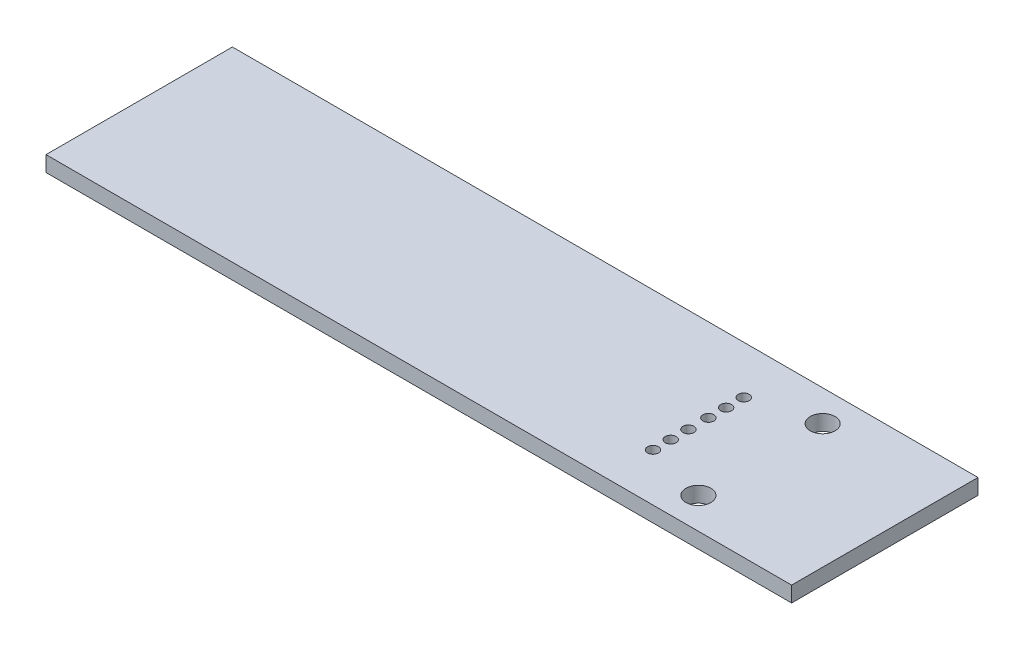
ISO-10303-21;
HEADER;
FILE_DESCRIPTION(('STEP AP214'),'2;1');
FILE_NAME('part.step','',(''),(''),'','','');
FILE_SCHEMA(('AUTOMOTIVE_DESIGN { 1 0 10303 214 1 1 1 1 }'));
ENDSEC;
DATA;
#1=APPLICATION_CONTEXT('core data for automotive mechanical design processes');
#2=APPLICATION_PROTOCOL_DEFINITION('international standard','automotive_design',2000,#1);
#3=PRODUCT_CONTEXT('',#1,'mechanical');
#4=PRODUCT('Part','Part','',(#3));
#5=PRODUCT_RELATED_PRODUCT_CATEGORY('part','',(#4));
#6=PRODUCT_DEFINITION_FORMATION('','',#4);
#7=PRODUCT_DEFINITION_CONTEXT('part definition',#1,'design');
#8=PRODUCT_DEFINITION('design','',#6,#7);
#9=PRODUCT_DEFINITION_SHAPE('','',#8);
#10=(LENGTH_UNIT() NAMED_UNIT(*) SI_UNIT(.MILLI.,.METRE.));
#11=(NAMED_UNIT(*) PLANE_ANGLE_UNIT() SI_UNIT($,.RADIAN.));
#12=(NAMED_UNIT(*) SI_UNIT($,.STERADIAN.) SOLID_ANGLE_UNIT());
#13=UNCERTAINTY_MEASURE_WITH_UNIT(LENGTH_MEASURE(1.E-05),#10,'distance_accuracy_value','');
#14=(GEOMETRIC_REPRESENTATION_CONTEXT(3) GLOBAL_UNCERTAINTY_ASSIGNED_CONTEXT((#13)) GLOBAL_UNIT_ASSIGNED_CONTEXT((#10,
#11,#12)) REPRESENTATION_CONTEXT('',''));
#15=CARTESIAN_POINT('',(0.,0.,0.));
#16=DIRECTION('',(0.,0.,1.));
#17=DIRECTION('',(1.,0.,0.));
#18=AXIS2_PLACEMENT_3D('',#15,#16,#17);
#19=CARTESIAN_POINT('',(0.,1.5875,0.));
#20=DIRECTION('',(0.,1.,0.));
#21=DIRECTION('',(0.,0.,1.));
#22=AXIS2_PLACEMENT_3D('',#19,#20,#21);
#23=PLANE('',#22);
#24=CARTESIAN_POINT('',(19.05,1.5875,-2.82923288451083));
#25=DIRECTION('',(0.,1.,0.));
#26=DIRECTION('',(0.,0.,1.));
#27=AXIS2_PLACEMENT_3D('',#24,#25,#26);
#28=CIRCLE('',#27,0.558095422726709);
#29=CARTESIAN_POINT('',(19.05,1.5875,-2.27113746178412));
#30=VERTEX_POINT('',#29);
#31=EDGE_CURVE('E147',#30,#30,#28,.T.);
#32=ORIENTED_EDGE('',*,*,#31,.F.);
#33=EDGE_LOOP('',(#32));
#34=FACE_BOUND('',#33,.T.);
#35=CARTESIAN_POINT('',(19.05,1.5875,1.021597478357));
#36=DIRECTION('',(0.,1.,0.));
#37=DIRECTION('',(0.,0.,1.));
#38=AXIS2_PLACEMENT_3D('',#35,#36,#37);
#39=CIRCLE('',#38,0.558095422726705);
#40=CARTESIAN_POINT('',(19.05,1.5875,1.5796929010837));
#41=VERTEX_POINT('',#40);
#42=EDGE_CURVE('E135',#41,#41,#39,.T.);
#43=ORIENTED_EDGE('',*,*,#42,.F.);
#44=EDGE_LOOP('',(#43));
#45=FACE_BOUND('',#44,.T.);
#46=CARTESIAN_POINT('',(19.05,1.5875,4.63686829066466));
#47=DIRECTION('',(0.,1.,0.));
#48=DIRECTION('',(0.,0.,1.));
#49=AXIS2_PLACEMENT_3D('',#46,#47,#48);
#50=CIRCLE('',#49,0.558095422726705);
#51=CARTESIAN_POINT('',(19.05,1.5875,5.19496371339137));
#52=VERTEX_POINT('',#51);
#53=EDGE_CURVE('E123',#52,#52,#50,.T.);
#54=ORIENTED_EDGE('',*,*,#53,.F.);
#55=EDGE_LOOP('',(#54));
#56=FACE_BOUND('',#55,.T.);
#57=CARTESIAN_POINT('',(25.4,1.5875,-6.35));
#58=DIRECTION('',(0.,1.,0.));
#59=DIRECTION('',(0.,0.,1.));
#60=AXIS2_PLACEMENT_3D('',#57,#58,#59);
#61=CIRCLE('',#60,1.27);
#62=CARTESIAN_POINT('',(25.4,1.5875,-5.08));
#63=VERTEX_POINT('',#62);
#64=EDGE_CURVE('E102',#63,#63,#61,.T.);
#65=ORIENTED_EDGE('',*,*,#64,.F.);
#66=EDGE_LOOP('',(#65));
#67=FACE_BOUND('',#66,.T.);
#68=DIRECTION('',(0.,0.,1.));
#69=VECTOR('',#68,1.);
#70=CARTESIAN_POINT('',(-38.1,1.5875,-9.525));
#71=LINE('',#70,#69);
#72=CARTESIAN_POINT('',(-38.1,1.5875,-9.525));
#73=VERTEX_POINT('',#72);
#74=CARTESIAN_POINT('',(-38.1,1.5875,9.525));
#75=VERTEX_POINT('',#74);
#76=EDGE_CURVE('E87',#73,#75,#71,.T.);
#77=ORIENTED_EDGE('',*,*,#76,.T.);
#78=DIRECTION('',(1.,0.,0.));
#79=VECTOR('',#78,1.);
#80=CARTESIAN_POINT('',(-38.1,1.5875,9.525));
#81=LINE('',#80,#79);
#82=CARTESIAN_POINT('',(38.1,1.5875,9.525));
#83=VERTEX_POINT('',#82);
#84=EDGE_CURVE('E82',#75,#83,#81,.T.);
#85=ORIENTED_EDGE('',*,*,#84,.T.);
#86=DIRECTION('',(0.,0.,-1.));
#87=VECTOR('',#86,1.);
#88=CARTESIAN_POINT('',(38.1,1.5875,-9.525));
#89=LINE('',#88,#87);
#90=CARTESIAN_POINT('',(38.1,1.5875,-9.525));
#91=VERTEX_POINT('',#90);
#92=EDGE_CURVE('E85',#83,#91,#89,.T.);
#93=ORIENTED_EDGE('',*,*,#92,.T.);
#94=DIRECTION('',(-1.,0.,0.));
#95=VECTOR('',#94,1.);
#96=CARTESIAN_POINT('',(-38.1,1.5875,-9.525));
#97=LINE('',#96,#95);
#98=EDGE_CURVE('E52',#91,#73,#97,.T.);
#99=ORIENTED_EDGE('',*,*,#98,.T.);
#100=EDGE_LOOP('',(#77,#85,#93,#99));
#101=FACE_BOUND('',#100,.T.);
#102=CARTESIAN_POINT('',(25.4,1.5875,6.35));
#103=DIRECTION('',(0.,1.,0.));
#104=DIRECTION('',(0.,0.,1.));
#105=AXIS2_PLACEMENT_3D('',#102,#103,#104);
#106=CIRCLE('',#105,1.27);
#107=CARTESIAN_POINT('',(25.4,1.5875,7.62));
#108=VERTEX_POINT('',#107);
#109=EDGE_CURVE('E117',#108,#108,#106,.T.);
#110=ORIENTED_EDGE('',*,*,#109,.F.);
#111=EDGE_LOOP('',(#110));
#112=FACE_BOUND('',#111,.T.);
#113=CARTESIAN_POINT('',(19.05,1.5875,2.82923288451083));
#114=DIRECTION('',(0.,1.,0.));
#115=DIRECTION('',(0.,0.,1.));
#116=AXIS2_PLACEMENT_3D('',#113,#114,#115);
#117=CIRCLE('',#116,0.558095422726705);
#118=CARTESIAN_POINT('',(19.05,1.5875,3.38732830723753));
#119=VERTEX_POINT('',#118);
#120=EDGE_CURVE('E129',#119,#119,#117,.T.);
#121=ORIENTED_EDGE('',*,*,#120,.F.);
#122=EDGE_LOOP('',(#121));
#123=FACE_BOUND('',#122,.T.);
#124=CARTESIAN_POINT('',(19.05,1.5875,-4.63686829066466));
#125=DIRECTION('',(0.,1.,0.));
#126=DIRECTION('',(0.,0.,1.));
#127=AXIS2_PLACEMENT_3D('',#124,#125,#126);
#128=CIRCLE('',#127,0.558095422726709);
#129=CARTESIAN_POINT('',(19.05,1.5875,-4.07877286793795));
#130=VERTEX_POINT('',#129);
#131=EDGE_CURVE('E141',#130,#130,#128,.T.);
#132=ORIENTED_EDGE('',*,*,#131,.F.);
#133=EDGE_LOOP('',(#132));
#134=FACE_BOUND('',#133,.T.);
#135=CARTESIAN_POINT('',(19.05,1.5875,-1.021597478357));
#136=DIRECTION('',(0.,1.,0.));
#137=DIRECTION('',(0.,0.,1.));
#138=AXIS2_PLACEMENT_3D('',#135,#136,#137);
#139=CIRCLE('',#138,0.558095422726709);
#140=CARTESIAN_POINT('',(19.05,1.5875,-0.46350205563029));
#141=VERTEX_POINT('',#140);
#142=EDGE_CURVE('E153',#141,#141,#139,.T.);
#143=ORIENTED_EDGE('',*,*,#142,.F.);
#144=EDGE_LOOP('',(#143));
#145=FACE_BOUND('',#144,.T.);
#146=ADVANCED_FACE('F35',(#34,#45,#56,#67,#101,#112,#123,#134,#145),#23,.T.);
#147=CARTESIAN_POINT('',(0.,0.,0.));
#148=DIRECTION('',(0.,1.,0.));
#149=DIRECTION('',(0.,0.,1.));
#150=AXIS2_PLACEMENT_3D('',#147,#148,#149);
#151=PLANE('',#150);
#152=DIRECTION('',(0.,0.,1.));
#153=VECTOR('',#152,1.);
#154=CARTESIAN_POINT('',(-38.1,0.,-9.525));
#155=LINE('',#154,#153);
#156=CARTESIAN_POINT('',(-38.1,0.,-9.525));
#157=VERTEX_POINT('',#156);
#158=CARTESIAN_POINT('',(-38.1,0.,9.525));
#159=VERTEX_POINT('',#158);
#160=EDGE_CURVE('E99',#157,#159,#155,.T.);
#161=ORIENTED_EDGE('',*,*,#160,.F.);
#162=DIRECTION('',(-1.,0.,0.));
#163=VECTOR('',#162,1.);
#164=CARTESIAN_POINT('',(-38.1,0.,-9.525));
#165=LINE('',#164,#163);
#166=CARTESIAN_POINT('',(38.1,0.,-9.525));
#167=VERTEX_POINT('',#166);
#168=EDGE_CURVE('E75',#167,#157,#165,.T.);
#169=ORIENTED_EDGE('',*,*,#168,.F.);
#170=DIRECTION('',(0.,0.,-1.));
#171=VECTOR('',#170,1.);
#172=CARTESIAN_POINT('',(38.1,0.,-9.525));
#173=LINE('',#172,#171);
#174=CARTESIAN_POINT('',(38.1,0.,9.525));
#175=VERTEX_POINT('',#174);
#176=EDGE_CURVE('E69',#175,#167,#173,.T.);
#177=ORIENTED_EDGE('',*,*,#176,.F.);
#178=DIRECTION('',(1.,0.,0.));
#179=VECTOR('',#178,1.);
#180=CARTESIAN_POINT('',(-38.1,0.,9.525));
#181=LINE('',#180,#179);
#182=EDGE_CURVE('E91',#159,#175,#181,.T.);
#183=ORIENTED_EDGE('',*,*,#182,.F.);
#184=EDGE_LOOP('',(#161,#169,#177,#183));
#185=FACE_BOUND('',#184,.T.);
#186=CARTESIAN_POINT('',(25.4,0.,-6.35));
#187=DIRECTION('',(0.,1.,0.));
#188=DIRECTION('',(0.,0.,1.));
#189=AXIS2_PLACEMENT_3D('',#186,#187,#188);
#190=CIRCLE('',#189,1.27);
#191=CARTESIAN_POINT('',(25.4,0.,-5.08));
#192=VERTEX_POINT('',#191);
#193=EDGE_CURVE('E114',#192,#192,#190,.T.);
#194=ORIENTED_EDGE('',*,*,#193,.T.);
#195=EDGE_LOOP('',(#194));
#196=FACE_BOUND('',#195,.T.);
#197=CARTESIAN_POINT('',(25.4,0.,6.35));
#198=DIRECTION('',(0.,1.,0.));
#199=DIRECTION('',(0.,0.,1.));
#200=AXIS2_PLACEMENT_3D('',#197,#198,#199);
#201=CIRCLE('',#200,1.27);
#202=CARTESIAN_POINT('',(25.4,0.,7.62));
#203=VERTEX_POINT('',#202);
#204=EDGE_CURVE('E120',#203,#203,#201,.T.);
#205=ORIENTED_EDGE('',*,*,#204,.T.);
#206=EDGE_LOOP('',(#205));
#207=FACE_BOUND('',#206,.T.);
#208=CARTESIAN_POINT('',(19.05,0.,4.63686829066466));
#209=DIRECTION('',(0.,1.,0.));
#210=DIRECTION('',(0.,0.,1.));
#211=AXIS2_PLACEMENT_3D('',#208,#209,#210);
#212=CIRCLE('',#211,0.558095422726705);
#213=CARTESIAN_POINT('',(19.05,0.,5.19496371339137));
#214=VERTEX_POINT('',#213);
#215=EDGE_CURVE('E126',#214,#214,#212,.T.);
#216=ORIENTED_EDGE('',*,*,#215,.T.);
#217=EDGE_LOOP('',(#216));
#218=FACE_BOUND('',#217,.T.);
#219=CARTESIAN_POINT('',(19.05,0.,2.82923288451083));
#220=DIRECTION('',(0.,1.,0.));
#221=DIRECTION('',(0.,0.,1.));
#222=AXIS2_PLACEMENT_3D('',#219,#220,#221);
#223=CIRCLE('',#222,0.558095422726705);
#224=CARTESIAN_POINT('',(19.05,0.,3.38732830723753));
#225=VERTEX_POINT('',#224);
#226=EDGE_CURVE('E132',#225,#225,#223,.T.);
#227=ORIENTED_EDGE('',*,*,#226,.T.);
#228=EDGE_LOOP('',(#227));
#229=FACE_BOUND('',#228,.T.);
#230=CARTESIAN_POINT('',(19.05,0.,1.021597478357));
#231=DIRECTION('',(0.,1.,0.));
#232=DIRECTION('',(0.,0.,1.));
#233=AXIS2_PLACEMENT_3D('',#230,#231,#232);
#234=CIRCLE('',#233,0.558095422726705);
#235=CARTESIAN_POINT('',(19.05,0.,1.5796929010837));
#236=VERTEX_POINT('',#235);
#237=EDGE_CURVE('E138',#236,#236,#234,.T.);
#238=ORIENTED_EDGE('',*,*,#237,.T.);
#239=EDGE_LOOP('',(#238));
#240=FACE_BOUND('',#239,.T.);
#241=CARTESIAN_POINT('',(19.05,0.,-4.63686829066466));
#242=DIRECTION('',(0.,1.,0.));
#243=DIRECTION('',(0.,0.,1.));
#244=AXIS2_PLACEMENT_3D('',#241,#242,#243);
#245=CIRCLE('',#244,0.558095422726709);
#246=CARTESIAN_POINT('',(19.05,0.,-4.07877286793795));
#247=VERTEX_POINT('',#246);
#248=EDGE_CURVE('E144',#247,#247,#245,.T.);
#249=ORIENTED_EDGE('',*,*,#248,.T.);
#250=EDGE_LOOP('',(#249));
#251=FACE_BOUND('',#250,.T.);
#252=CARTESIAN_POINT('',(19.05,0.,-2.82923288451083));
#253=DIRECTION('',(0.,1.,0.));
#254=DIRECTION('',(0.,0.,1.));
#255=AXIS2_PLACEMENT_3D('',#252,#253,#254);
#256=CIRCLE('',#255,0.558095422726709);
#257=CARTESIAN_POINT('',(19.05,0.,-2.27113746178412));
#258=VERTEX_POINT('',#257);
#259=EDGE_CURVE('E150',#258,#258,#256,.T.);
#260=ORIENTED_EDGE('',*,*,#259,.T.);
#261=EDGE_LOOP('',(#260));
#262=FACE_BOUND('',#261,.T.);
#263=CARTESIAN_POINT('',(19.05,0.,-1.021597478357));
#264=DIRECTION('',(0.,1.,0.));
#265=DIRECTION('',(0.,0.,1.));
#266=AXIS2_PLACEMENT_3D('',#263,#264,#265);
#267=CIRCLE('',#266,0.558095422726709);
#268=CARTESIAN_POINT('',(19.05,0.,-0.46350205563029));
#269=VERTEX_POINT('',#268);
#270=EDGE_CURVE('E156',#269,#269,#267,.T.);
#271=ORIENTED_EDGE('',*,*,#270,.T.);
#272=EDGE_LOOP('',(#271));
#273=FACE_BOUND('',#272,.T.);
#274=ADVANCED_FACE('F110',(#185,#196,#207,#218,#229,#240,#251,#262,#273),#151,.F.);
#275=CARTESIAN_POINT('',(-38.1,1.5875,-9.525));
#276=DIRECTION('',(1.,0.,0.));
#277=DIRECTION('',(0.,0.,-1.));
#278=AXIS2_PLACEMENT_3D('',#275,#276,#277);
#279=PLANE('',#278);
#280=ORIENTED_EDGE('',*,*,#160,.T.);
#281=DIRECTION('',(0.,-1.,0.));
#282=VECTOR('',#281,1.);
#283=CARTESIAN_POINT('',(-38.1,1.5875,9.525));
#284=LINE('',#283,#282);
#285=EDGE_CURVE('E11',#75,#159,#284,.T.);
#286=ORIENTED_EDGE('',*,*,#285,.F.);
#287=ORIENTED_EDGE('',*,*,#76,.F.);
#288=DIRECTION('',(0.,-1.,0.));
#289=VECTOR('',#288,1.);
#290=CARTESIAN_POINT('',(-38.1,1.5875,-9.525));
#291=LINE('',#290,#289);
#292=EDGE_CURVE('E95',#73,#157,#291,.T.);
#293=ORIENTED_EDGE('',*,*,#292,.T.);
#294=EDGE_LOOP('',(#280,#286,#287,#293));
#295=FACE_BOUND('',#294,.T.);
#296=ADVANCED_FACE('F37',(#295),#279,.F.);
#297=CARTESIAN_POINT('',(-38.1,1.5875,9.525));
#298=DIRECTION('',(0.,0.,-1.));
#299=DIRECTION('',(-1.,0.,0.));
#300=AXIS2_PLACEMENT_3D('',#297,#298,#299);
#301=PLANE('',#300);
#302=ORIENTED_EDGE('',*,*,#182,.T.);
#303=DIRECTION('',(0.,-1.,0.));
#304=VECTOR('',#303,1.);
#305=CARTESIAN_POINT('',(38.1,1.5875,9.525));
#306=LINE('',#305,#304);
#307=EDGE_CURVE('E44',#83,#175,#306,.T.);
#308=ORIENTED_EDGE('',*,*,#307,.F.);
#309=ORIENTED_EDGE('',*,*,#84,.F.);
#310=ORIENTED_EDGE('',*,*,#285,.T.);
#311=EDGE_LOOP('',(#302,#308,#309,#310));
#312=FACE_BOUND('',#311,.T.);
#313=ADVANCED_FACE('F90',(#312),#301,.F.);
#314=CARTESIAN_POINT('',(38.1,1.5875,-9.525));
#315=DIRECTION('',(-1.,0.,0.));
#316=DIRECTION('',(0.,0.,1.));
#317=AXIS2_PLACEMENT_3D('',#314,#315,#316);
#318=PLANE('',#317);
#319=ORIENTED_EDGE('',*,*,#176,.T.);
#320=DIRECTION('',(0.,-1.,0.));
#321=VECTOR('',#320,1.);
#322=CARTESIAN_POINT('',(38.1,1.5875,-9.525));
#323=LINE('',#322,#321);
#324=EDGE_CURVE('E92',#91,#167,#323,.T.);
#325=ORIENTED_EDGE('',*,*,#324,.F.);
#326=ORIENTED_EDGE('',*,*,#92,.F.);
#327=ORIENTED_EDGE('',*,*,#307,.T.);
#328=EDGE_LOOP('',(#319,#325,#326,#327));
#329=FACE_BOUND('',#328,.T.);
#330=ADVANCED_FACE('F93',(#329),#318,.F.);
#331=CARTESIAN_POINT('',(-38.1,1.5875,-9.525));
#332=DIRECTION('',(0.,0.,1.));
#333=DIRECTION('',(1.,0.,0.));
#334=AXIS2_PLACEMENT_3D('',#331,#332,#333);
#335=PLANE('',#334);
#336=ORIENTED_EDGE('',*,*,#168,.T.);
#337=ORIENTED_EDGE('',*,*,#292,.F.);
#338=ORIENTED_EDGE('',*,*,#98,.F.);
#339=ORIENTED_EDGE('',*,*,#324,.T.);
#340=EDGE_LOOP('',(#336,#337,#338,#339));
#341=FACE_BOUND('',#340,.T.);
#342=ADVANCED_FACE('F107',(#341),#335,.F.);
#343=CARTESIAN_POINT('',(25.4,1.5875,-6.35));
#344=DIRECTION('',(0.,-1.,0.));
#345=DIRECTION('',(0.,0.,-1.));
#346=AXIS2_PLACEMENT_3D('',#343,#344,#345);
#347=CYLINDRICAL_SURFACE('',#346,1.27);
#348=ORIENTED_EDGE('',*,*,#64,.T.);
#349=EDGE_LOOP('',(#348));
#350=FACE_BOUND('',#349,.T.);
#351=ORIENTED_EDGE('',*,*,#193,.F.);
#352=EDGE_LOOP('',(#351));
#353=FACE_BOUND('',#352,.T.);
#354=ADVANCED_FACE('F175',(#350,#353),#347,.F.);
#355=CARTESIAN_POINT('',(25.4,1.5875,6.35));
#356=DIRECTION('',(0.,-1.,0.));
#357=DIRECTION('',(0.,0.,-1.));
#358=AXIS2_PLACEMENT_3D('',#355,#356,#357);
#359=CYLINDRICAL_SURFACE('',#358,1.27);
#360=ORIENTED_EDGE('',*,*,#109,.T.);
#361=EDGE_LOOP('',(#360));
#362=FACE_BOUND('',#361,.T.);
#363=ORIENTED_EDGE('',*,*,#204,.F.);
#364=EDGE_LOOP('',(#363));
#365=FACE_BOUND('',#364,.T.);
#366=ADVANCED_FACE('F221',(#362,#365),#359,.F.);
#367=CARTESIAN_POINT('',(19.05,1.5875,4.63686829066466));
#368=DIRECTION('',(0.,-1.,0.));
#369=DIRECTION('',(0.,0.,-1.));
#370=AXIS2_PLACEMENT_3D('',#367,#368,#369);
#371=CYLINDRICAL_SURFACE('',#370,0.558095422726705);
#372=ORIENTED_EDGE('',*,*,#53,.T.);
#373=EDGE_LOOP('',(#372));
#374=FACE_BOUND('',#373,.T.);
#375=ORIENTED_EDGE('',*,*,#215,.F.);
#376=EDGE_LOOP('',(#375));
#377=FACE_BOUND('',#376,.T.);
#378=ADVANCED_FACE('F229',(#374,#377),#371,.F.);
#379=CARTESIAN_POINT('',(19.05,1.5875,2.82923288451083));
#380=DIRECTION('',(0.,-1.,0.));
#381=DIRECTION('',(0.,0.,-1.));
#382=AXIS2_PLACEMENT_3D('',#379,#380,#381);
#383=CYLINDRICAL_SURFACE('',#382,0.558095422726705);
#384=ORIENTED_EDGE('',*,*,#120,.T.);
#385=EDGE_LOOP('',(#384));
#386=FACE_BOUND('',#385,.T.);
#387=ORIENTED_EDGE('',*,*,#226,.F.);
#388=EDGE_LOOP('',(#387));
#389=FACE_BOUND('',#388,.T.);
#390=ADVANCED_FACE('F237',(#386,#389),#383,.F.);
#391=CARTESIAN_POINT('',(19.05,1.5875,1.021597478357));
#392=DIRECTION('',(0.,-1.,0.));
#393=DIRECTION('',(0.,0.,-1.));
#394=AXIS2_PLACEMENT_3D('',#391,#392,#393);
#395=CYLINDRICAL_SURFACE('',#394,0.558095422726705);
#396=ORIENTED_EDGE('',*,*,#42,.T.);
#397=EDGE_LOOP('',(#396));
#398=FACE_BOUND('',#397,.T.);
#399=ORIENTED_EDGE('',*,*,#237,.F.);
#400=EDGE_LOOP('',(#399));
#401=FACE_BOUND('',#400,.T.);
#402=ADVANCED_FACE('F246',(#398,#401),#395,.F.);
#403=CARTESIAN_POINT('',(19.05,1.5875,-4.63686829066466));
#404=DIRECTION('',(0.,-1.,0.));
#405=DIRECTION('',(0.,0.,-1.));
#406=AXIS2_PLACEMENT_3D('',#403,#404,#405);
#407=CYLINDRICAL_SURFACE('',#406,0.558095422726709);
#408=ORIENTED_EDGE('',*,*,#131,.T.);
#409=EDGE_LOOP('',(#408));
#410=FACE_BOUND('',#409,.T.);
#411=ORIENTED_EDGE('',*,*,#248,.F.);
#412=EDGE_LOOP('',(#411));
#413=FACE_BOUND('',#412,.T.);
#414=ADVANCED_FACE('F255',(#410,#413),#407,.F.);
#415=CARTESIAN_POINT('',(19.05,1.5875,-2.82923288451083));
#416=DIRECTION('',(0.,-1.,0.));
#417=DIRECTION('',(0.,0.,-1.));
#418=AXIS2_PLACEMENT_3D('',#415,#416,#417);
#419=CYLINDRICAL_SURFACE('',#418,0.558095422726709);
#420=ORIENTED_EDGE('',*,*,#31,.T.);
#421=EDGE_LOOP('',(#420));
#422=FACE_BOUND('',#421,.T.);
#423=ORIENTED_EDGE('',*,*,#259,.F.);
#424=EDGE_LOOP('',(#423));
#425=FACE_BOUND('',#424,.T.);
#426=ADVANCED_FACE('F264',(#422,#425),#419,.F.);
#427=CARTESIAN_POINT('',(19.05,1.5875,-1.021597478357));
#428=DIRECTION('',(0.,-1.,0.));
#429=DIRECTION('',(0.,0.,-1.));
#430=AXIS2_PLACEMENT_3D('',#427,#428,#429);
#431=CYLINDRICAL_SURFACE('',#430,0.558095422726709);
#432=ORIENTED_EDGE('',*,*,#142,.T.);
#433=EDGE_LOOP('',(#432));
#434=FACE_BOUND('',#433,.T.);
#435=ORIENTED_EDGE('',*,*,#270,.F.);
#436=EDGE_LOOP('',(#435));
#437=FACE_BOUND('',#436,.T.);
#438=ADVANCED_FACE('F162',(#434,#437),#431,.F.);
#439=CLOSED_SHELL('',(#146,#274,#296,#313,#330,#342,#354,#366,#378,#390,#402,#414,#426,#438));
#440=MANIFOLD_SOLID_BREP('B2',#439);
#441=ADVANCED_BREP_SHAPE_REPRESENTATION('',(#18,#440),#14);
#442=SHAPE_DEFINITION_REPRESENTATION(#9,#441);
ENDSEC;
END-ISO-10303-21;
